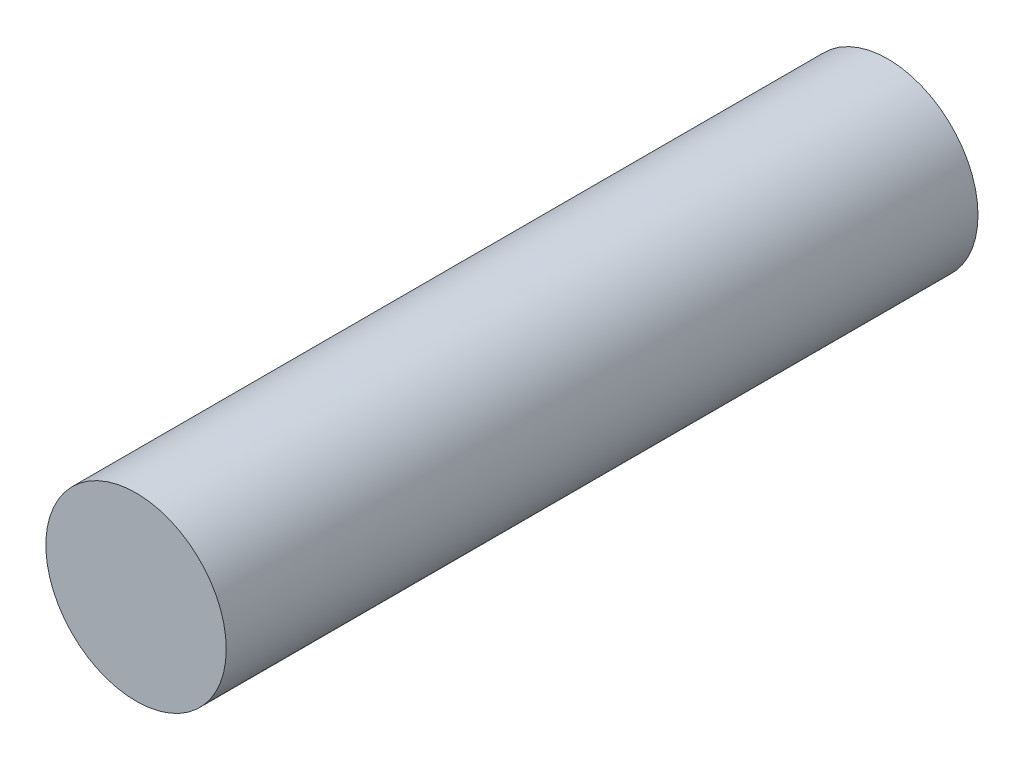
ISO-10303-21;
HEADER;
FILE_DESCRIPTION(('STEP AP214'),'2;1');
FILE_NAME('part.step','',(''),(''),'','','');
FILE_SCHEMA(('AUTOMOTIVE_DESIGN { 1 0 10303 214 1 1 1 1 }'));
ENDSEC;
DATA;
#1=APPLICATION_CONTEXT('core data for automotive mechanical design processes');
#2=APPLICATION_PROTOCOL_DEFINITION('international standard','automotive_design',2000,#1);
#3=PRODUCT_CONTEXT('',#1,'mechanical');
#4=PRODUCT('Part','Part','',(#3));
#5=PRODUCT_RELATED_PRODUCT_CATEGORY('part','',(#4));
#6=PRODUCT_DEFINITION_FORMATION('','',#4);
#7=PRODUCT_DEFINITION_CONTEXT('part definition',#1,'design');
#8=PRODUCT_DEFINITION('design','',#6,#7);
#9=PRODUCT_DEFINITION_SHAPE('','',#8);
#10=(LENGTH_UNIT() NAMED_UNIT(*) SI_UNIT(.MILLI.,.METRE.));
#11=(NAMED_UNIT(*) PLANE_ANGLE_UNIT() SI_UNIT($,.RADIAN.));
#12=(NAMED_UNIT(*) SI_UNIT($,.STERADIAN.) SOLID_ANGLE_UNIT());
#13=UNCERTAINTY_MEASURE_WITH_UNIT(LENGTH_MEASURE(1.E-05),#10,'distance_accuracy_value','');
#14=(GEOMETRIC_REPRESENTATION_CONTEXT(3) GLOBAL_UNCERTAINTY_ASSIGNED_CONTEXT((#13)) GLOBAL_UNIT_ASSIGNED_CONTEXT((#10,
#11,#12)) REPRESENTATION_CONTEXT('',''));
#15=CARTESIAN_POINT('',(0.,0.,0.));
#16=DIRECTION('',(0.,0.,1.));
#17=DIRECTION('',(1.,0.,0.));
#18=AXIS2_PLACEMENT_3D('',#15,#16,#17);
#19=CARTESIAN_POINT('',(0.,0.,-25.));
#20=DIRECTION('',(0.,0.,1.));
#21=DIRECTION('',(1.,0.,0.));
#22=AXIS2_PLACEMENT_3D('',#19,#20,#21);
#23=CYLINDRICAL_SURFACE('',#22,6.);
#24=CARTESIAN_POINT('',(0.,0.,-25.));
#25=DIRECTION('',(0.,0.,1.));
#26=DIRECTION('',(1.,0.,0.));
#27=AXIS2_PLACEMENT_3D('',#24,#25,#26);
#28=CIRCLE('',#27,6.);
#29=CARTESIAN_POINT('',(6.,0.,-25.));
#30=VERTEX_POINT('',#29);
#31=EDGE_CURVE('E10',#30,#30,#28,.T.);
#32=ORIENTED_EDGE('',*,*,#31,.T.);
#33=EDGE_LOOP('',(#32));
#34=FACE_BOUND('',#33,.T.);
#35=CARTESIAN_POINT('',(0.,0.,25.));
#36=DIRECTION('',(0.,0.,1.));
#37=DIRECTION('',(1.,0.,0.));
#38=AXIS2_PLACEMENT_3D('',#35,#36,#37);
#39=CIRCLE('',#38,6.);
#40=CARTESIAN_POINT('',(6.,0.,25.));
#41=VERTEX_POINT('',#40);
#42=EDGE_CURVE('E37',#41,#41,#39,.T.);
#43=ORIENTED_EDGE('',*,*,#42,.F.);
#44=EDGE_LOOP('',(#43));
#45=FACE_BOUND('',#44,.T.);
#46=ADVANCED_FACE('F40',(#34,#45),#23,.T.);
#47=CARTESIAN_POINT('',(0.,0.,-25.));
#48=DIRECTION('',(0.,0.,1.));
#49=DIRECTION('',(1.,0.,0.));
#50=AXIS2_PLACEMENT_3D('',#47,#48,#49);
#51=PLANE('',#50);
#52=ORIENTED_EDGE('',*,*,#31,.F.);
#53=EDGE_LOOP('',(#52));
#54=FACE_BOUND('',#53,.T.);
#55=ADVANCED_FACE('F55',(#54),#51,.F.);
#56=CARTESIAN_POINT('',(0.,0.,25.));
#57=DIRECTION('',(0.,0.,1.));
#58=DIRECTION('',(1.,0.,0.));
#59=AXIS2_PLACEMENT_3D('',#56,#57,#58);
#60=PLANE('',#59);
#61=ORIENTED_EDGE('',*,*,#42,.T.);
#62=EDGE_LOOP('',(#61));
#63=FACE_BOUND('',#62,.T.);
#64=ADVANCED_FACE('F47',(#63),#60,.T.);
#65=CLOSED_SHELL('',(#46,#55,#64));
#66=MANIFOLD_SOLID_BREP('B2',#65);
#67=ADVANCED_BREP_SHAPE_REPRESENTATION('',(#18,#66),#14);
#68=SHAPE_DEFINITION_REPRESENTATION(#9,#67);
ENDSEC;
END-ISO-10303-21;
